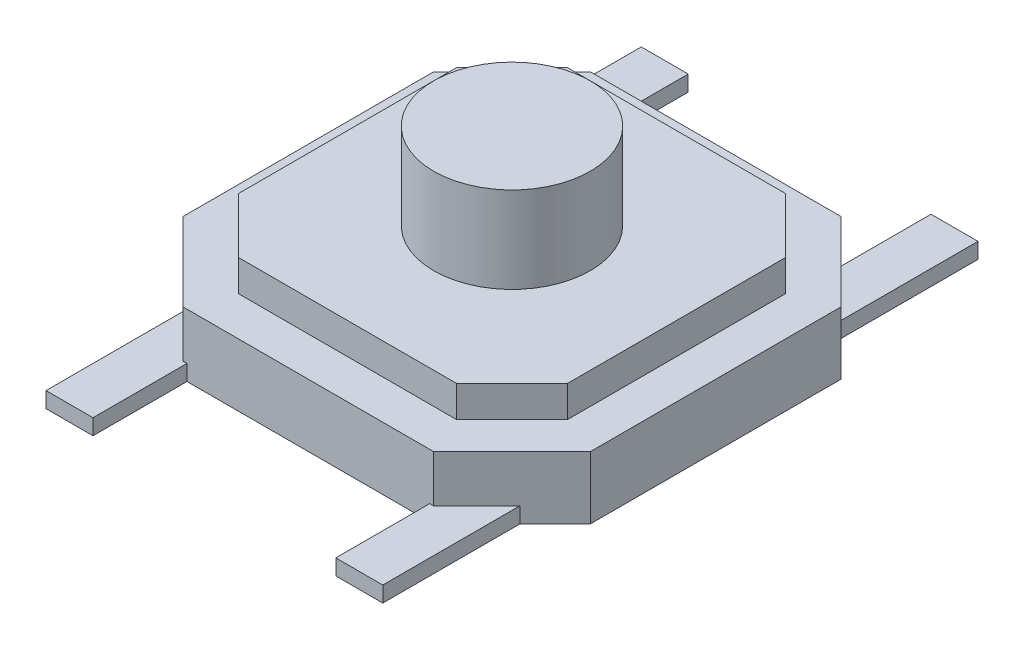
ISO-10303-21;
HEADER;
FILE_DESCRIPTION(('STEP AP214'),'2;1');
FILE_NAME('part.step','',(''),(''),'','','');
FILE_SCHEMA(('AUTOMOTIVE_DESIGN { 1 0 10303 214 1 1 1 1 }'));
ENDSEC;
DATA;
#1=APPLICATION_CONTEXT('core data for automotive mechanical design processes');
#2=APPLICATION_PROTOCOL_DEFINITION('international standard','automotive_design',2000,#1);
#3=PRODUCT_CONTEXT('',#1,'mechanical');
#4=PRODUCT('Part','Part','',(#3));
#5=PRODUCT_RELATED_PRODUCT_CATEGORY('part','',(#4));
#6=PRODUCT_DEFINITION_FORMATION('','',#4);
#7=PRODUCT_DEFINITION_CONTEXT('part definition',#1,'design');
#8=PRODUCT_DEFINITION('design','',#6,#7);
#9=PRODUCT_DEFINITION_SHAPE('','',#8);
#10=(LENGTH_UNIT() NAMED_UNIT(*) SI_UNIT(.MILLI.,.METRE.));
#11=(NAMED_UNIT(*) PLANE_ANGLE_UNIT() SI_UNIT($,.RADIAN.));
#12=(NAMED_UNIT(*) SI_UNIT($,.STERADIAN.) SOLID_ANGLE_UNIT());
#13=UNCERTAINTY_MEASURE_WITH_UNIT(LENGTH_MEASURE(1.E-05),#10,'distance_accuracy_value','');
#14=(GEOMETRIC_REPRESENTATION_CONTEXT(3) GLOBAL_UNCERTAINTY_ASSIGNED_CONTEXT((#13)) GLOBAL_UNIT_ASSIGNED_CONTEXT((#10,
#11,#12)) REPRESENTATION_CONTEXT('',''));
#15=CARTESIAN_POINT('',(0.,0.,0.));
#16=DIRECTION('',(0.,0.,1.));
#17=DIRECTION('',(1.,0.,0.));
#18=AXIS2_PLACEMENT_3D('',#15,#16,#17);
#19=CARTESIAN_POINT('',(-2.6,1.2,-2.60000000000001));
#20=DIRECTION('',(0.,1.,0.));
#21=DIRECTION('',(0.,0.,1.));
#22=AXIS2_PLACEMENT_3D('',#19,#20,#21);
#23=PLANE('',#22);
#24=DIRECTION('',(-1.,0.,0.));
#25=VECTOR('',#24,1.);
#26=CARTESIAN_POINT('',(1.39289321881345,1.2,-2.10000000000001));
#27=LINE('',#26,#25);
#28=CARTESIAN_POINT('',(1.39289321881345,1.2,-2.10000000000001));
#29=VERTEX_POINT('',#28);
#30=CARTESIAN_POINT('',(-1.39289321881345,1.2,-2.10000000000001));
#31=VERTEX_POINT('',#30);
#32=EDGE_CURVE('E363',#29,#31,#27,.T.);
#33=ORIENTED_EDGE('',*,*,#32,.T.);
#34=DIRECTION('',(-0.707106781186549,0.,0.707106781186546));
#35=VECTOR('',#34,1.);
#36=CARTESIAN_POINT('',(-1.39289321881345,1.2,-2.10000000000001));
#37=LINE('',#36,#35);
#38=CARTESIAN_POINT('',(-2.1,1.2,-1.39289321881346));
#39=VERTEX_POINT('',#38);
#40=EDGE_CURVE('E410',#31,#39,#37,.T.);
#41=ORIENTED_EDGE('',*,*,#40,.T.);
#42=DIRECTION('',(0.,0.,1.));
#43=VECTOR('',#42,1.);
#44=CARTESIAN_POINT('',(-2.1,1.2,-1.39289321881346));
#45=LINE('',#44,#43);
#46=CARTESIAN_POINT('',(-2.1,1.2,1.39289321881344));
#47=VERTEX_POINT('',#46);
#48=EDGE_CURVE('E407',#39,#47,#45,.T.);
#49=ORIENTED_EDGE('',*,*,#48,.T.);
#50=DIRECTION('',(0.707106781186546,0.,0.707106781186549));
#51=VECTOR('',#50,1.);
#52=CARTESIAN_POINT('',(-2.1,1.2,1.39289321881344));
#53=LINE('',#52,#51);
#54=CARTESIAN_POINT('',(-1.39289321881345,1.2,2.09999999999999));
#55=VERTEX_POINT('',#54);
#56=EDGE_CURVE('E404',#47,#55,#53,.T.);
#57=ORIENTED_EDGE('',*,*,#56,.T.);
#58=DIRECTION('',(1.,0.,0.));
#59=VECTOR('',#58,1.);
#60=CARTESIAN_POINT('',(-1.39289321881345,1.2,2.09999999999999));
#61=LINE('',#60,#59);
#62=CARTESIAN_POINT('',(1.39289321881347,1.2,2.09999999999999));
#63=VERTEX_POINT('',#62);
#64=EDGE_CURVE('E401',#55,#63,#61,.T.);
#65=ORIENTED_EDGE('',*,*,#64,.T.);
#66=DIRECTION('',(0.707106781186549,0.,-0.707106781186546));
#67=VECTOR('',#66,1.);
#68=CARTESIAN_POINT('',(1.39289321881347,1.2,2.09999999999999));
#69=LINE('',#68,#67);
#70=CARTESIAN_POINT('',(2.10000000000002,1.2,1.39289321881345));
#71=VERTEX_POINT('',#70);
#72=EDGE_CURVE('E398',#63,#71,#69,.T.);
#73=ORIENTED_EDGE('',*,*,#72,.T.);
#74=DIRECTION('',(0.,0.,-1.));
#75=VECTOR('',#74,1.);
#76=CARTESIAN_POINT('',(2.10000000000002,1.2,1.39289321881345));
#77=LINE('',#76,#75);
#78=CARTESIAN_POINT('',(2.1,1.2,-1.39289321881346));
#79=VERTEX_POINT('',#78);
#80=EDGE_CURVE('E395',#71,#79,#77,.T.);
#81=ORIENTED_EDGE('',*,*,#80,.T.);
#82=DIRECTION('',(-0.70710678118655,0.,-0.707106781186545));
#83=VECTOR('',#82,1.);
#84=CARTESIAN_POINT('',(2.1,1.2,-1.39289321881346));
#85=LINE('',#84,#83);
#86=EDGE_CURVE('E391',#79,#29,#85,.T.);
#87=ORIENTED_EDGE('',*,*,#86,.T.);
#88=EDGE_LOOP('',(#33,#41,#49,#57,#65,#73,#81,#87));
#89=FACE_BOUND('',#88,.T.);
#90=CARTESIAN_POINT('',(0.,1.2,0.));
#91=DIRECTION('',(0.,1.,0.));
#92=DIRECTION('',(0.,0.,1.));
#93=AXIS2_PLACEMENT_3D('',#90,#91,#92);
#94=CIRCLE('',#93,1.);
#95=CARTESIAN_POINT('',(0.,1.2,1.));
#96=VERTEX_POINT('',#95);
#97=EDGE_CURVE('E353',#96,#96,#94,.T.);
#98=ORIENTED_EDGE('',*,*,#97,.F.);
#99=EDGE_LOOP('',(#98));
#100=FACE_BOUND('',#99,.T.);
#101=ADVANCED_FACE('F35',(#89,#100),#23,.T.);
#102=CARTESIAN_POINT('',(-2.6,0.8,-2.60000000000001));
#103=DIRECTION('',(0.,1.,0.));
#104=DIRECTION('',(0.,0.,1.));
#105=AXIS2_PLACEMENT_3D('',#102,#103,#104);
#106=PLANE('',#105);
#107=DIRECTION('',(0.,0.,-1.));
#108=VECTOR('',#107,1.);
#109=CARTESIAN_POINT('',(2.6,0.8,-2.60000000000001));
#110=LINE('',#109,#108);
#111=CARTESIAN_POINT('',(2.60000000000002,0.8,1.6));
#112=VERTEX_POINT('',#111);
#113=CARTESIAN_POINT('',(2.6,0.8,-1.6));
#114=VERTEX_POINT('',#113);
#115=EDGE_CURVE('E431',#112,#114,#110,.T.);
#116=ORIENTED_EDGE('',*,*,#115,.T.);
#117=DIRECTION('',(0.70710678118655,0.,0.707106781186545));
#118=VECTOR('',#117,1.);
#119=CARTESIAN_POINT('',(-0.500000000000016,0.8,-4.7));
#120=LINE('',#119,#118);
#121=CARTESIAN_POINT('',(1.59999999999999,0.8,-2.60000000000001));
#122=VERTEX_POINT('',#121);
#123=EDGE_CURVE('E473',#114,#122,#120,.F.);
#124=ORIENTED_EDGE('',*,*,#123,.T.);
#125=DIRECTION('',(-1.,0.,0.));
#126=VECTOR('',#125,1.);
#127=CARTESIAN_POINT('',(-2.6,0.8,-2.60000000000001));
#128=LINE('',#127,#126);
#129=CARTESIAN_POINT('',(-1.6,0.8,-2.60000000000001));
#130=VERTEX_POINT('',#129);
#131=EDGE_CURVE('E434',#122,#130,#128,.T.);
#132=ORIENTED_EDGE('',*,*,#131,.T.);
#133=DIRECTION('',(0.707106781186549,0.,-0.707106781186546));
#134=VECTOR('',#133,1.);
#135=CARTESIAN_POINT('',(-2.1,0.8,-2.10000000000001));
#136=LINE('',#135,#134);
#137=CARTESIAN_POINT('',(-2.6,0.8,-1.60000000000001));
#138=VERTEX_POINT('',#137);
#139=EDGE_CURVE('E467',#130,#138,#136,.F.);
#140=ORIENTED_EDGE('',*,*,#139,.T.);
#141=DIRECTION('',(0.,0.,1.));
#142=VECTOR('',#141,1.);
#143=CARTESIAN_POINT('',(-2.6,0.8,-2.60000000000001));
#144=LINE('',#143,#142);
#145=CARTESIAN_POINT('',(-2.6,0.8,1.59999999999999));
#146=VERTEX_POINT('',#145);
#147=EDGE_CURVE('E424',#138,#146,#144,.T.);
#148=ORIENTED_EDGE('',*,*,#147,.T.);
#149=DIRECTION('',(-0.707106781186547,0.,-0.707106781186548));
#150=VECTOR('',#149,1.);
#151=CARTESIAN_POINT('',(-4.7,0.8,-0.500000000000014));
#152=LINE('',#151,#150);
#153=CARTESIAN_POINT('',(-1.6,0.8,2.59999999999999));
#154=VERTEX_POINT('',#153);
#155=EDGE_CURVE('E469',#146,#154,#152,.F.);
#156=ORIENTED_EDGE('',*,*,#155,.T.);
#157=DIRECTION('',(1.,0.,0.));
#158=VECTOR('',#157,1.);
#159=CARTESIAN_POINT('',(-2.6,0.8,2.59999999999999));
#160=LINE('',#159,#158);
#161=CARTESIAN_POINT('',(1.60000000000002,0.8,2.59999999999999));
#162=VERTEX_POINT('',#161);
#163=EDGE_CURVE('E427',#154,#162,#160,.T.);
#164=ORIENTED_EDGE('',*,*,#163,.T.);
#165=DIRECTION('',(-0.707106781186549,0.,0.707106781186546));
#166=VECTOR('',#165,1.);
#167=CARTESIAN_POINT('',(2.1,0.8,2.10000000000001));
#168=LINE('',#167,#166);
#169=EDGE_CURVE('E471',#162,#112,#168,.F.);
#170=ORIENTED_EDGE('',*,*,#169,.T.);
#171=EDGE_LOOP('',(#116,#124,#132,#140,#148,#156,#164,#170));
#172=FACE_BOUND('',#171,.T.);
#173=DIRECTION('',(0.,0.,1.));
#174=VECTOR('',#173,1.);
#175=CARTESIAN_POINT('',(-2.1,0.8,-1.39289321881346));
#176=LINE('',#175,#174);
#177=CARTESIAN_POINT('',(-2.1,0.8,-1.39289321881346));
#178=VERTEX_POINT('',#177);
#179=CARTESIAN_POINT('',(-2.1,0.8,1.39289321881344));
#180=VERTEX_POINT('',#179);
#181=EDGE_CURVE('E384',#178,#180,#176,.T.);
#182=ORIENTED_EDGE('',*,*,#181,.F.);
#183=DIRECTION('',(-0.707106781186549,0.,0.707106781186546));
#184=VECTOR('',#183,1.);
#185=CARTESIAN_POINT('',(-1.39289321881345,0.8,-2.10000000000001));
#186=LINE('',#185,#184);
#187=CARTESIAN_POINT('',(-1.39289321881345,0.8,-2.10000000000001));
#188=VERTEX_POINT('',#187);
#189=EDGE_CURVE('E388',#188,#178,#186,.T.);
#190=ORIENTED_EDGE('',*,*,#189,.F.);
#191=DIRECTION('',(-1.,0.,0.));
#192=VECTOR('',#191,1.);
#193=CARTESIAN_POINT('',(1.39289321881345,0.8,-2.10000000000001));
#194=LINE('',#193,#192);
#195=CARTESIAN_POINT('',(1.39289321881345,0.8,-2.10000000000001));
#196=VERTEX_POINT('',#195);
#197=EDGE_CURVE('E360',#196,#188,#194,.T.);
#198=ORIENTED_EDGE('',*,*,#197,.F.);
#199=DIRECTION('',(-0.70710678118655,0.,-0.707106781186545));
#200=VECTOR('',#199,1.);
#201=CARTESIAN_POINT('',(2.1,0.8,-1.39289321881346));
#202=LINE('',#201,#200);
#203=CARTESIAN_POINT('',(2.1,0.8,-1.39289321881346));
#204=VERTEX_POINT('',#203);
#205=EDGE_CURVE('E365',#204,#196,#202,.T.);
#206=ORIENTED_EDGE('',*,*,#205,.F.);
#207=DIRECTION('',(0.,0.,-1.));
#208=VECTOR('',#207,1.);
#209=CARTESIAN_POINT('',(2.10000000000002,0.8,1.39289321881345));
#210=LINE('',#209,#208);
#211=CARTESIAN_POINT('',(2.10000000000002,0.8,1.39289321881345));
#212=VERTEX_POINT('',#211);
#213=EDGE_CURVE('E368',#212,#204,#210,.T.);
#214=ORIENTED_EDGE('',*,*,#213,.F.);
#215=DIRECTION('',(0.707106781186549,0.,-0.707106781186546));
#216=VECTOR('',#215,1.);
#217=CARTESIAN_POINT('',(1.39289321881347,0.8,2.09999999999999));
#218=LINE('',#217,#216);
#219=CARTESIAN_POINT('',(1.39289321881347,0.8,2.09999999999999));
#220=VERTEX_POINT('',#219);
#221=EDGE_CURVE('E372',#220,#212,#218,.T.);
#222=ORIENTED_EDGE('',*,*,#221,.F.);
#223=DIRECTION('',(1.,0.,0.));
#224=VECTOR('',#223,1.);
#225=CARTESIAN_POINT('',(-1.39289321881345,0.8,2.09999999999999));
#226=LINE('',#225,#224);
#227=CARTESIAN_POINT('',(-1.39289321881345,0.8,2.09999999999999));
#228=VERTEX_POINT('',#227);
#229=EDGE_CURVE('E376',#228,#220,#226,.T.);
#230=ORIENTED_EDGE('',*,*,#229,.F.);
#231=DIRECTION('',(0.707106781186546,0.,0.707106781186549));
#232=VECTOR('',#231,1.);
#233=CARTESIAN_POINT('',(-2.1,0.8,1.39289321881344));
#234=LINE('',#233,#232);
#235=EDGE_CURVE('E380',#180,#228,#234,.T.);
#236=ORIENTED_EDGE('',*,*,#235,.F.);
#237=EDGE_LOOP('',(#182,#190,#198,#206,#214,#222,#230,#236));
#238=FACE_BOUND('',#237,.T.);
#239=ADVANCED_FACE('F519',(#172,#238),#106,.T.);
#240=CARTESIAN_POINT('',(-2.6,0.8,-2.60000000000001));
#241=DIRECTION('',(1.,0.,0.));
#242=DIRECTION('',(0.,0.,-1.));
#243=AXIS2_PLACEMENT_3D('',#240,#241,#242);
#244=PLANE('',#243);
#245=DIRECTION('',(0.,0.,1.));
#246=VECTOR('',#245,1.);
#247=CARTESIAN_POINT('',(-2.6,0.,-2.60000000000001));
#248=LINE('',#247,#246);
#249=CARTESIAN_POINT('',(-2.6,0.,-1.60000000000001));
#250=VERTEX_POINT('',#249);
#251=CARTESIAN_POINT('',(-2.6,0.,1.59999999999999));
#252=VERTEX_POINT('',#251);
#253=EDGE_CURVE('E394',#250,#252,#248,.T.);
#254=ORIENTED_EDGE('',*,*,#253,.T.);
#255=DIRECTION('',(0.,1.,0.));
#256=VECTOR('',#255,1.);
#257=CARTESIAN_POINT('',(-2.6,0.8,1.59999999999999));
#258=LINE('',#257,#256);
#259=EDGE_CURVE('E483',#252,#146,#258,.T.);
#260=ORIENTED_EDGE('',*,*,#259,.T.);
#261=ORIENTED_EDGE('',*,*,#147,.F.);
#262=DIRECTION('',(0.,-1.,0.));
#263=VECTOR('',#262,1.);
#264=CARTESIAN_POINT('',(-2.6,0.8,-1.60000000000001));
#265=LINE('',#264,#263);
#266=EDGE_CURVE('E480',#138,#250,#265,.T.);
#267=ORIENTED_EDGE('',*,*,#266,.T.);
#268=EDGE_LOOP('',(#254,#260,#261,#267));
#269=FACE_BOUND('',#268,.T.);
#270=ADVANCED_FACE('F515',(#269),#244,.F.);
#271=CARTESIAN_POINT('',(-2.6,0.8,2.59999999999999));
#272=DIRECTION('',(0.,0.,-1.));
#273=DIRECTION('',(-1.,0.,0.));
#274=AXIS2_PLACEMENT_3D('',#271,#272,#273);
#275=PLANE('',#274);
#276=DIRECTION('',(1.,0.,0.));
#277=VECTOR('',#276,1.);
#278=CARTESIAN_POINT('',(-2.6,0.,2.59999999999999));
#279=LINE('',#278,#277);
#280=CARTESIAN_POINT('',(-1.55,0.,2.59999999999999));
#281=VERTEX_POINT('',#280);
#282=CARTESIAN_POINT('',(1.55,0.,2.59999999999999));
#283=VERTEX_POINT('',#282);
#284=EDGE_CURVE('E440',#281,#283,#279,.T.);
#285=ORIENTED_EDGE('',*,*,#284,.T.);
#286=DIRECTION('',(0.,1.,0.));
#287=VECTOR('',#286,1.);
#288=CARTESIAN_POINT('',(1.55,0.8,2.59999999999999));
#289=LINE('',#288,#287);
#290=CARTESIAN_POINT('',(1.55,0.2,2.59999999999999));
#291=VERTEX_POINT('',#290);
#292=EDGE_CURVE('E327',#283,#291,#289,.T.);
#293=ORIENTED_EDGE('',*,*,#292,.T.);
#294=DIRECTION('',(-1.,0.,0.));
#295=VECTOR('',#294,1.);
#296=CARTESIAN_POINT('',(-2.6,0.2,2.59999999999999));
#297=LINE('',#296,#295);
#298=CARTESIAN_POINT('',(1.60000000000002,0.2,2.59999999999999));
#299=VERTEX_POINT('',#298);
#300=EDGE_CURVE('E323',#299,#291,#297,.T.);
#301=ORIENTED_EDGE('',*,*,#300,.F.);
#302=DIRECTION('',(0.,1.,0.));
#303=VECTOR('',#302,1.);
#304=CARTESIAN_POINT('',(1.60000000000002,0.8,2.59999999999999));
#305=LINE('',#304,#303);
#306=EDGE_CURVE('E478',#299,#162,#305,.T.);
#307=ORIENTED_EDGE('',*,*,#306,.T.);
#308=ORIENTED_EDGE('',*,*,#163,.F.);
#309=DIRECTION('',(0.,-1.,0.));
#310=VECTOR('',#309,1.);
#311=CARTESIAN_POINT('',(-1.6,0.8,2.59999999999999));
#312=LINE('',#311,#310);
#313=CARTESIAN_POINT('',(-1.6,0.2,2.59999999999999));
#314=VERTEX_POINT('',#313);
#315=EDGE_CURVE('E475',#154,#314,#312,.T.);
#316=ORIENTED_EDGE('',*,*,#315,.T.);
#317=DIRECTION('',(-1.,0.,0.));
#318=VECTOR('',#317,1.);
#319=CARTESIAN_POINT('',(-2.6,0.2,2.59999999999999));
#320=LINE('',#319,#318);
#321=CARTESIAN_POINT('',(-1.55,0.2,2.59999999999999));
#322=VERTEX_POINT('',#321);
#323=EDGE_CURVE('E346',#322,#314,#320,.T.);
#324=ORIENTED_EDGE('',*,*,#323,.F.);
#325=DIRECTION('',(0.,-1.,0.));
#326=VECTOR('',#325,1.);
#327=CARTESIAN_POINT('',(-1.55,0.8,2.59999999999999));
#328=LINE('',#327,#326);
#329=EDGE_CURVE('E350',#322,#281,#328,.T.);
#330=ORIENTED_EDGE('',*,*,#329,.T.);
#331=EDGE_LOOP('',(#285,#293,#301,#307,#308,#316,#324,#330));
#332=FACE_BOUND('',#331,.T.);
#333=ADVANCED_FACE('F529',(#332),#275,.F.);
#334=CARTESIAN_POINT('',(2.6,0.8,-2.60000000000001));
#335=DIRECTION('',(-1.,0.,0.));
#336=DIRECTION('',(0.,0.,1.));
#337=AXIS2_PLACEMENT_3D('',#334,#335,#336);
#338=PLANE('',#337);
#339=DIRECTION('',(0.,0.,-1.));
#340=VECTOR('',#339,1.);
#341=CARTESIAN_POINT('',(2.6,0.,-2.60000000000001));
#342=LINE('',#341,#340);
#343=CARTESIAN_POINT('',(2.60000000000002,0.,1.6));
#344=VERTEX_POINT('',#343);
#345=CARTESIAN_POINT('',(2.6,0.,-1.6));
#346=VERTEX_POINT('',#345);
#347=EDGE_CURVE('E443',#344,#346,#342,.T.);
#348=ORIENTED_EDGE('',*,*,#347,.T.);
#349=DIRECTION('',(0.,1.,0.));
#350=VECTOR('',#349,1.);
#351=CARTESIAN_POINT('',(2.6,0.8,-1.6));
#352=LINE('',#351,#350);
#353=EDGE_CURVE('E465',#346,#114,#352,.T.);
#354=ORIENTED_EDGE('',*,*,#353,.T.);
#355=ORIENTED_EDGE('',*,*,#115,.F.);
#356=DIRECTION('',(0.,-1.,0.));
#357=VECTOR('',#356,1.);
#358=CARTESIAN_POINT('',(2.60000000000002,0.8,1.6));
#359=LINE('',#358,#357);
#360=EDGE_CURVE('E462',#112,#344,#359,.T.);
#361=ORIENTED_EDGE('',*,*,#360,.T.);
#362=EDGE_LOOP('',(#348,#354,#355,#361));
#363=FACE_BOUND('',#362,.T.);
#364=ADVANCED_FACE('F540',(#363),#338,.F.);
#365=CARTESIAN_POINT('',(-2.6,0.8,-2.60000000000001));
#366=DIRECTION('',(0.,0.,1.));
#367=DIRECTION('',(1.,0.,0.));
#368=AXIS2_PLACEMENT_3D('',#365,#366,#367);
#369=PLANE('',#368);
#370=DIRECTION('',(-1.,0.,0.));
#371=VECTOR('',#370,1.);
#372=CARTESIAN_POINT('',(-2.6,0.,-2.60000000000001));
#373=LINE('',#372,#371);
#374=CARTESIAN_POINT('',(1.55,0.,-2.60000000000001));
#375=VERTEX_POINT('',#374);
#376=CARTESIAN_POINT('',(-1.55,0.,-2.60000000000001));
#377=VERTEX_POINT('',#376);
#378=EDGE_CURVE('E428',#375,#377,#373,.T.);
#379=ORIENTED_EDGE('',*,*,#378,.T.);
#380=DIRECTION('',(0.,1.,0.));
#381=VECTOR('',#380,1.);
#382=CARTESIAN_POINT('',(-1.55,0.8,-2.60000000000001));
#383=LINE('',#382,#381);
#384=CARTESIAN_POINT('',(-1.55,0.2,-2.60000000000001));
#385=VERTEX_POINT('',#384);
#386=EDGE_CURVE('E278',#377,#385,#383,.T.);
#387=ORIENTED_EDGE('',*,*,#386,.T.);
#388=DIRECTION('',(1.,0.,0.));
#389=VECTOR('',#388,1.);
#390=CARTESIAN_POINT('',(-2.6,0.2,-2.60000000000001));
#391=LINE('',#390,#389);
#392=CARTESIAN_POINT('',(-1.6,0.2,-2.60000000000001));
#393=VERTEX_POINT('',#392);
#394=EDGE_CURVE('E275',#393,#385,#391,.T.);
#395=ORIENTED_EDGE('',*,*,#394,.F.);
#396=DIRECTION('',(0.,1.,0.));
#397=VECTOR('',#396,1.);
#398=CARTESIAN_POINT('',(-1.6,0.8,-2.60000000000001));
#399=LINE('',#398,#397);
#400=EDGE_CURVE('E437',#393,#130,#399,.T.);
#401=ORIENTED_EDGE('',*,*,#400,.T.);
#402=ORIENTED_EDGE('',*,*,#131,.F.);
#403=DIRECTION('',(0.,-1.,0.));
#404=VECTOR('',#403,1.);
#405=CARTESIAN_POINT('',(1.59999999999999,0.8,-2.60000000000001));
#406=LINE('',#405,#404);
#407=CARTESIAN_POINT('',(1.59999999999999,0.2,-2.60000000000001));
#408=VERTEX_POINT('',#407);
#409=EDGE_CURVE('E449',#122,#408,#406,.T.);
#410=ORIENTED_EDGE('',*,*,#409,.T.);
#411=DIRECTION('',(1.,0.,0.));
#412=VECTOR('',#411,1.);
#413=CARTESIAN_POINT('',(-2.6,0.2,-2.60000000000001));
#414=LINE('',#413,#412);
#415=CARTESIAN_POINT('',(1.55,0.2,-2.60000000000001));
#416=VERTEX_POINT('',#415);
#417=EDGE_CURVE('E297',#416,#408,#414,.T.);
#418=ORIENTED_EDGE('',*,*,#417,.F.);
#419=DIRECTION('',(0.,-1.,0.));
#420=VECTOR('',#419,1.);
#421=CARTESIAN_POINT('',(1.55,0.8,-2.60000000000001));
#422=LINE('',#421,#420);
#423=EDGE_CURVE('E301',#416,#375,#422,.T.);
#424=ORIENTED_EDGE('',*,*,#423,.T.);
#425=EDGE_LOOP('',(#379,#387,#395,#401,#402,#410,#418,#424));
#426=FACE_BOUND('',#425,.T.);
#427=ADVANCED_FACE('F504',(#426),#369,.F.);
#428=CARTESIAN_POINT('',(-2.6,0.,-2.60000000000001));
#429=DIRECTION('',(0.,1.,0.));
#430=DIRECTION('',(0.,0.,1.));
#431=AXIS2_PLACEMENT_3D('',#428,#429,#430);
#432=PLANE('',#431);
#433=DIRECTION('',(0.,0.,1.));
#434=VECTOR('',#433,1.);
#435=CARTESIAN_POINT('',(-1.55,0.,-1.13168776971169));
#436=LINE('',#435,#434);
#437=CARTESIAN_POINT('',(-1.55,0.,-3.79999999999999));
#438=VERTEX_POINT('',#437);
#439=EDGE_CURVE('E254',#438,#377,#436,.T.);
#440=ORIENTED_EDGE('',*,*,#439,.T.);
#441=ORIENTED_EDGE('',*,*,#378,.F.);
#442=DIRECTION('',(0.,0.,-1.));
#443=VECTOR('',#442,1.);
#444=CARTESIAN_POINT('',(1.55,0.,-1.13168776971169));
#445=LINE('',#444,#443);
#446=CARTESIAN_POINT('',(1.55,0.,-3.79999999999999));
#447=VERTEX_POINT('',#446);
#448=EDGE_CURVE('E281',#375,#447,#445,.T.);
#449=ORIENTED_EDGE('',*,*,#448,.T.);
#450=DIRECTION('',(1.,0.,0.));
#451=VECTOR('',#450,1.);
#452=CARTESIAN_POINT('',(1.55,0.,-3.79999999999999));
#453=LINE('',#452,#451);
#454=CARTESIAN_POINT('',(2.15,0.,-3.79999999999999));
#455=VERTEX_POINT('',#454);
#456=EDGE_CURVE('E292',#447,#455,#453,.T.);
#457=ORIENTED_EDGE('',*,*,#456,.T.);
#458=DIRECTION('',(0.,0.,1.));
#459=VECTOR('',#458,1.);
#460=CARTESIAN_POINT('',(2.15,0.,-1.13168776971169));
#461=LINE('',#460,#459);
#462=CARTESIAN_POINT('',(2.15,0.,-2.05000000000001));
#463=VERTEX_POINT('',#462);
#464=EDGE_CURVE('E50',#455,#463,#461,.T.);
#465=ORIENTED_EDGE('',*,*,#464,.T.);
#466=DIRECTION('',(-0.70710678118655,0.,-0.707106781186545));
#467=VECTOR('',#466,1.);
#468=CARTESIAN_POINT('',(1.59999999999999,0.,-2.60000000000001));
#469=LINE('',#468,#467);
#470=EDGE_CURVE('E460',#463,#346,#469,.F.);
#471=ORIENTED_EDGE('',*,*,#470,.T.);
#472=ORIENTED_EDGE('',*,*,#347,.F.);
#473=DIRECTION('',(0.707106781186549,0.,-0.707106781186546));
#474=VECTOR('',#473,1.);
#475=CARTESIAN_POINT('',(2.60000000000002,0.,1.6));
#476=LINE('',#475,#474);
#477=CARTESIAN_POINT('',(2.15,0.,2.05000000000001));
#478=VERTEX_POINT('',#477);
#479=EDGE_CURVE('E457',#344,#478,#476,.F.);
#480=ORIENTED_EDGE('',*,*,#479,.T.);
#481=DIRECTION('',(0.,0.,1.));
#482=VECTOR('',#481,1.);
#483=CARTESIAN_POINT('',(2.15,0.,1.13168776971169));
#484=LINE('',#483,#482);
#485=CARTESIAN_POINT('',(2.15,0.,3.79999999999999));
#486=VERTEX_POINT('',#485);
#487=EDGE_CURVE('E304',#478,#486,#484,.T.);
#488=ORIENTED_EDGE('',*,*,#487,.T.);
#489=DIRECTION('',(-1.,0.,0.));
#490=VECTOR('',#489,1.);
#491=CARTESIAN_POINT('',(1.55,0.,3.79999999999999));
#492=LINE('',#491,#490);
#493=CARTESIAN_POINT('',(1.55,0.,3.79999999999999));
#494=VERTEX_POINT('',#493);
#495=EDGE_CURVE('E316',#486,#494,#492,.T.);
#496=ORIENTED_EDGE('',*,*,#495,.T.);
#497=DIRECTION('',(0.,0.,-1.));
#498=VECTOR('',#497,1.);
#499=CARTESIAN_POINT('',(1.55,0.,1.13168776971169));
#500=LINE('',#499,#498);
#501=EDGE_CURVE('E308',#494,#283,#500,.T.);
#502=ORIENTED_EDGE('',*,*,#501,.T.);
#503=ORIENTED_EDGE('',*,*,#284,.F.);
#504=DIRECTION('',(0.,0.,1.));
#505=VECTOR('',#504,1.);
#506=CARTESIAN_POINT('',(-1.55,0.,1.13168776971169));
#507=LINE('',#506,#505);
#508=CARTESIAN_POINT('',(-1.55,0.,3.79999999999999));
#509=VERTEX_POINT('',#508);
#510=EDGE_CURVE('E330',#281,#509,#507,.T.);
#511=ORIENTED_EDGE('',*,*,#510,.T.);
#512=DIRECTION('',(-1.,0.,0.));
#513=VECTOR('',#512,1.);
#514=CARTESIAN_POINT('',(-1.55,0.,3.79999999999999));
#515=LINE('',#514,#513);
#516=CARTESIAN_POINT('',(-2.15,0.,3.79999999999999));
#517=VERTEX_POINT('',#516);
#518=EDGE_CURVE('E341',#509,#517,#515,.T.);
#519=ORIENTED_EDGE('',*,*,#518,.T.);
#520=DIRECTION('',(0.,0.,-1.));
#521=VECTOR('',#520,1.);
#522=CARTESIAN_POINT('',(-2.15,0.,1.13168776971169));
#523=LINE('',#522,#521);
#524=CARTESIAN_POINT('',(-2.15,0.,2.04999999999999));
#525=VERTEX_POINT('',#524);
#526=EDGE_CURVE('E57',#517,#525,#523,.T.);
#527=ORIENTED_EDGE('',*,*,#526,.T.);
#528=DIRECTION('',(0.707106781186547,0.,0.707106781186548));
#529=VECTOR('',#528,1.);
#530=CARTESIAN_POINT('',(-1.6,0.,2.59999999999999));
#531=LINE('',#530,#529);
#532=EDGE_CURVE('E455',#525,#252,#531,.F.);
#533=ORIENTED_EDGE('',*,*,#532,.T.);
#534=ORIENTED_EDGE('',*,*,#253,.F.);
#535=DIRECTION('',(-0.707106781186549,0.,0.707106781186546));
#536=VECTOR('',#535,1.);
#537=CARTESIAN_POINT('',(-2.6,0.,-1.60000000000001));
#538=LINE('',#537,#536);
#539=CARTESIAN_POINT('',(-2.15,0.,-2.05000000000001));
#540=VERTEX_POINT('',#539);
#541=EDGE_CURVE('E452',#250,#540,#538,.F.);
#542=ORIENTED_EDGE('',*,*,#541,.T.);
#543=DIRECTION('',(0.,0.,-1.));
#544=VECTOR('',#543,1.);
#545=CARTESIAN_POINT('',(-2.15,0.,-1.13168776971169));
#546=LINE('',#545,#544);
#547=CARTESIAN_POINT('',(-2.15,0.,-3.79999999999999));
#548=VERTEX_POINT('',#547);
#549=EDGE_CURVE('E270',#540,#548,#546,.T.);
#550=ORIENTED_EDGE('',*,*,#549,.T.);
#551=DIRECTION('',(1.,0.,0.));
#552=VECTOR('',#551,1.);
#553=CARTESIAN_POINT('',(-1.55,0.,-3.79999999999999));
#554=LINE('',#553,#552);
#555=EDGE_CURVE('E261',#548,#438,#554,.T.);
#556=ORIENTED_EDGE('',*,*,#555,.T.);
#557=EDGE_LOOP('',(#440,#441,#449,#457,#465,#471,#472,#480,#488,#496,#502,#503,#511,#519,#527,
#533,#534,#542,#550,#556));
#558=FACE_BOUND('',#557,.T.);
#559=ADVANCED_FACE('F510',(#558),#432,.F.);
#560=CARTESIAN_POINT('',(1.59999999999999,0.8,-2.60000000000001));
#561=DIRECTION('',(-0.707106781186545,0.,0.70710678118655));
#562=DIRECTION('',(0.,-1.,0.));
#563=AXIS2_PLACEMENT_3D('',#560,#561,#562);
#564=PLANE('',#563);
#565=DIRECTION('',(0.,1.,0.));
#566=VECTOR('',#565,1.);
#567=CARTESIAN_POINT('',(2.15,0.8,-2.05000000000001));
#568=LINE('',#567,#566);
#569=CARTESIAN_POINT('',(2.15,0.2,-2.05000000000001));
#570=VERTEX_POINT('',#569);
#571=EDGE_CURVE('E498',#570,#463,#568,.F.);
#572=ORIENTED_EDGE('',*,*,#571,.F.);
#573=DIRECTION('',(0.70710678118655,0.,0.707106781186545));
#574=VECTOR('',#573,1.);
#575=CARTESIAN_POINT('',(1.59999999999999,0.2,-2.60000000000001));
#576=LINE('',#575,#574);
#577=EDGE_CURVE('E495',#570,#408,#576,.F.);
#578=ORIENTED_EDGE('',*,*,#577,.T.);
#579=ORIENTED_EDGE('',*,*,#409,.F.);
#580=ORIENTED_EDGE('',*,*,#123,.F.);
#581=ORIENTED_EDGE('',*,*,#353,.F.);
#582=ORIENTED_EDGE('',*,*,#470,.F.);
#583=EDGE_LOOP('',(#572,#578,#579,#580,#581,#582));
#584=FACE_BOUND('',#583,.T.);
#585=ADVANCED_FACE('F545',(#584),#564,.F.);
#586=CARTESIAN_POINT('',(2.60000000000002,0.8,1.6));
#587=DIRECTION('',(-0.707106781186546,0.,-0.707106781186549));
#588=DIRECTION('',(0.,-1.,0.));
#589=AXIS2_PLACEMENT_3D('',#586,#587,#588);
#590=PLANE('',#589);
#591=DIRECTION('',(0.,-1.,0.));
#592=VECTOR('',#591,1.);
#593=CARTESIAN_POINT('',(2.15,0.8,2.05000000000001));
#594=LINE('',#593,#592);
#595=CARTESIAN_POINT('',(2.15,0.2,2.05000000000001));
#596=VERTEX_POINT('',#595);
#597=EDGE_CURVE('E493',#478,#596,#594,.F.);
#598=ORIENTED_EDGE('',*,*,#597,.F.);
#599=ORIENTED_EDGE('',*,*,#479,.F.);
#600=ORIENTED_EDGE('',*,*,#360,.F.);
#601=ORIENTED_EDGE('',*,*,#169,.F.);
#602=ORIENTED_EDGE('',*,*,#306,.F.);
#603=DIRECTION('',(-0.707106781186549,0.,0.707106781186546));
#604=VECTOR('',#603,1.);
#605=CARTESIAN_POINT('',(2.60000000000002,0.2,1.6));
#606=LINE('',#605,#604);
#607=EDGE_CURVE('E490',#299,#596,#606,.F.);
#608=ORIENTED_EDGE('',*,*,#607,.T.);
#609=EDGE_LOOP('',(#598,#599,#600,#601,#602,#608));
#610=FACE_BOUND('',#609,.T.);
#611=ADVANCED_FACE('F537',(#610),#590,.F.);
#612=CARTESIAN_POINT('',(-1.6,0.8,2.59999999999999));
#613=DIRECTION('',(0.707106781186548,0.,-0.707106781186547));
#614=DIRECTION('',(0.,-1.,0.));
#615=AXIS2_PLACEMENT_3D('',#612,#613,#614);
#616=PLANE('',#615);
#617=DIRECTION('',(0.,1.,0.));
#618=VECTOR('',#617,1.);
#619=CARTESIAN_POINT('',(-2.15,0.8,2.04999999999999));
#620=LINE('',#619,#618);
#621=CARTESIAN_POINT('',(-2.15,0.2,2.04999999999999));
#622=VERTEX_POINT('',#621);
#623=EDGE_CURVE('E488',#622,#525,#620,.F.);
#624=ORIENTED_EDGE('',*,*,#623,.F.);
#625=DIRECTION('',(-0.707106781186547,0.,-0.707106781186548));
#626=VECTOR('',#625,1.);
#627=CARTESIAN_POINT('',(-1.6,0.2,2.59999999999999));
#628=LINE('',#627,#626);
#629=EDGE_CURVE('E485',#622,#314,#628,.F.);
#630=ORIENTED_EDGE('',*,*,#629,.T.);
#631=ORIENTED_EDGE('',*,*,#315,.F.);
#632=ORIENTED_EDGE('',*,*,#155,.F.);
#633=ORIENTED_EDGE('',*,*,#259,.F.);
#634=ORIENTED_EDGE('',*,*,#532,.F.);
#635=EDGE_LOOP('',(#624,#630,#631,#632,#633,#634));
#636=FACE_BOUND('',#635,.T.);
#637=ADVANCED_FACE('F525',(#636),#616,.F.);
#638=CARTESIAN_POINT('',(-2.6,0.8,-1.60000000000001));
#639=DIRECTION('',(0.707106781186546,0.,0.707106781186549));
#640=DIRECTION('',(0.,-1.,0.));
#641=AXIS2_PLACEMENT_3D('',#638,#639,#640);
#642=PLANE('',#641);
#643=DIRECTION('',(0.,-1.,0.));
#644=VECTOR('',#643,1.);
#645=CARTESIAN_POINT('',(-2.15,0.8,-2.05000000000001));
#646=LINE('',#645,#644);
#647=CARTESIAN_POINT('',(-2.15,0.2,-2.05000000000001));
#648=VERTEX_POINT('',#647);
#649=EDGE_CURVE('E12',#540,#648,#646,.F.);
#650=ORIENTED_EDGE('',*,*,#649,.F.);
#651=ORIENTED_EDGE('',*,*,#541,.F.);
#652=ORIENTED_EDGE('',*,*,#266,.F.);
#653=ORIENTED_EDGE('',*,*,#139,.F.);
#654=ORIENTED_EDGE('',*,*,#400,.F.);
#655=DIRECTION('',(0.707106781186549,0.,-0.707106781186546));
#656=VECTOR('',#655,1.);
#657=CARTESIAN_POINT('',(-2.6,0.2,-1.60000000000001));
#658=LINE('',#657,#656);
#659=EDGE_CURVE('E43',#393,#648,#658,.F.);
#660=ORIENTED_EDGE('',*,*,#659,.T.);
#661=EDGE_LOOP('',(#650,#651,#652,#653,#654,#660));
#662=FACE_BOUND('',#661,.T.);
#663=ADVANCED_FACE('F37',(#662),#642,.F.);
#664=CARTESIAN_POINT('',(-1.39289321881345,8.33969696196701,-2.10000000000001));
#665=DIRECTION('',(0.707106781186546,0.,0.707106781186549));
#666=DIRECTION('',(0.707106781186549,0.,-0.707106781186546));
#667=AXIS2_PLACEMENT_3D('',#664,#665,#666);
#668=PLANE('',#667);
#669=ORIENTED_EDGE('',*,*,#40,.F.);
#670=DIRECTION('',(0.,-1.,0.));
#671=VECTOR('',#670,1.);
#672=CARTESIAN_POINT('',(-1.39289321881345,8.33969696196701,-2.10000000000001));
#673=LINE('',#672,#671);
#674=EDGE_CURVE('E359',#31,#188,#673,.T.);
#675=ORIENTED_EDGE('',*,*,#674,.T.);
#676=ORIENTED_EDGE('',*,*,#189,.T.);
#677=DIRECTION('',(0.,-1.,0.));
#678=VECTOR('',#677,1.);
#679=CARTESIAN_POINT('',(-2.1,8.33969696196701,-1.39289321881346));
#680=LINE('',#679,#678);
#681=EDGE_CURVE('E387',#39,#178,#680,.T.);
#682=ORIENTED_EDGE('',*,*,#681,.F.);
#683=EDGE_LOOP('',(#669,#675,#676,#682));
#684=FACE_BOUND('',#683,.T.);
#685=ADVANCED_FACE('F584',(#684),#668,.F.);
#686=CARTESIAN_POINT('',(-2.1,8.33969696196701,-1.39289321881346));
#687=DIRECTION('',(1.,0.,0.));
#688=DIRECTION('',(0.,0.,-1.));
#689=AXIS2_PLACEMENT_3D('',#686,#687,#688);
#690=PLANE('',#689);
#691=ORIENTED_EDGE('',*,*,#48,.F.);
#692=ORIENTED_EDGE('',*,*,#681,.T.);
#693=ORIENTED_EDGE('',*,*,#181,.T.);
#694=DIRECTION('',(0.,-1.,0.));
#695=VECTOR('',#694,1.);
#696=CARTESIAN_POINT('',(-2.1,8.33969696196701,1.39289321881344));
#697=LINE('',#696,#695);
#698=EDGE_CURVE('E383',#47,#180,#697,.T.);
#699=ORIENTED_EDGE('',*,*,#698,.F.);
#700=EDGE_LOOP('',(#691,#692,#693,#699));
#701=FACE_BOUND('',#700,.T.);
#702=ADVANCED_FACE('F607',(#701),#690,.F.);
#703=CARTESIAN_POINT('',(-2.1,8.33969696196701,1.39289321881344));
#704=DIRECTION('',(0.707106781186549,0.,-0.707106781186546));
#705=DIRECTION('',(-0.707106781186546,0.,-0.707106781186549));
#706=AXIS2_PLACEMENT_3D('',#703,#704,#705);
#707=PLANE('',#706);
#708=ORIENTED_EDGE('',*,*,#56,.F.);
#709=ORIENTED_EDGE('',*,*,#698,.T.);
#710=ORIENTED_EDGE('',*,*,#235,.T.);
#711=DIRECTION('',(0.,-1.,0.));
#712=VECTOR('',#711,1.);
#713=CARTESIAN_POINT('',(-1.39289321881345,8.33969696196701,2.09999999999999));
#714=LINE('',#713,#712);
#715=EDGE_CURVE('E379',#55,#228,#714,.T.);
#716=ORIENTED_EDGE('',*,*,#715,.F.);
#717=EDGE_LOOP('',(#708,#709,#710,#716));
#718=FACE_BOUND('',#717,.T.);
#719=ADVANCED_FACE('F612',(#718),#707,.F.);
#720=CARTESIAN_POINT('',(-1.39289321881345,8.33969696196701,2.09999999999999));
#721=DIRECTION('',(0.,0.,-1.));
#722=DIRECTION('',(-1.,0.,0.));
#723=AXIS2_PLACEMENT_3D('',#720,#721,#722);
#724=PLANE('',#723);
#725=ORIENTED_EDGE('',*,*,#64,.F.);
#726=ORIENTED_EDGE('',*,*,#715,.T.);
#727=ORIENTED_EDGE('',*,*,#229,.T.);
#728=DIRECTION('',(0.,-1.,0.));
#729=VECTOR('',#728,1.);
#730=CARTESIAN_POINT('',(1.39289321881347,8.33969696196701,2.09999999999999));
#731=LINE('',#730,#729);
#732=EDGE_CURVE('E375',#63,#220,#731,.T.);
#733=ORIENTED_EDGE('',*,*,#732,.F.);
#734=EDGE_LOOP('',(#725,#726,#727,#733));
#735=FACE_BOUND('',#734,.T.);
#736=ADVANCED_FACE('F629',(#735),#724,.F.);
#737=CARTESIAN_POINT('',(1.39289321881347,8.33969696196701,2.09999999999999));
#738=DIRECTION('',(-0.707106781186546,0.,-0.707106781186549));
#739=DIRECTION('',(-0.707106781186549,0.,0.707106781186546));
#740=AXIS2_PLACEMENT_3D('',#737,#738,#739);
#741=PLANE('',#740);
#742=ORIENTED_EDGE('',*,*,#72,.F.);
#743=ORIENTED_EDGE('',*,*,#732,.T.);
#744=ORIENTED_EDGE('',*,*,#221,.T.);
#745=DIRECTION('',(0.,-1.,0.));
#746=VECTOR('',#745,1.);
#747=CARTESIAN_POINT('',(2.10000000000002,8.33969696196701,1.39289321881345));
#748=LINE('',#747,#746);
#749=EDGE_CURVE('E371',#71,#212,#748,.T.);
#750=ORIENTED_EDGE('',*,*,#749,.F.);
#751=EDGE_LOOP('',(#742,#743,#744,#750));
#752=FACE_BOUND('',#751,.T.);
#753=ADVANCED_FACE('F633',(#752),#741,.F.);
#754=CARTESIAN_POINT('',(2.10000000000002,8.33969696196701,1.39289321881345));
#755=DIRECTION('',(-1.,0.,0.));
#756=DIRECTION('',(0.,0.,1.));
#757=AXIS2_PLACEMENT_3D('',#754,#755,#756);
#758=PLANE('',#757);
#759=ORIENTED_EDGE('',*,*,#80,.F.);
#760=ORIENTED_EDGE('',*,*,#749,.T.);
#761=ORIENTED_EDGE('',*,*,#213,.T.);
#762=DIRECTION('',(0.,-1.,0.));
#763=VECTOR('',#762,1.);
#764=CARTESIAN_POINT('',(2.1,8.33969696196701,-1.39289321881346));
#765=LINE('',#764,#763);
#766=EDGE_CURVE('E367',#79,#204,#765,.T.);
#767=ORIENTED_EDGE('',*,*,#766,.F.);
#768=EDGE_LOOP('',(#759,#760,#761,#767));
#769=FACE_BOUND('',#768,.T.);
#770=ADVANCED_FACE('F638',(#769),#758,.F.);
#771=CARTESIAN_POINT('',(2.1,8.33969696196701,-1.39289321881346));
#772=DIRECTION('',(-0.707106781186545,0.,0.70710678118655));
#773=DIRECTION('',(0.70710678118655,0.,0.707106781186545));
#774=AXIS2_PLACEMENT_3D('',#771,#772,#773);
#775=PLANE('',#774);
#776=ORIENTED_EDGE('',*,*,#86,.F.);
#777=ORIENTED_EDGE('',*,*,#766,.T.);
#778=ORIENTED_EDGE('',*,*,#205,.T.);
#779=DIRECTION('',(0.,-1.,0.));
#780=VECTOR('',#779,1.);
#781=CARTESIAN_POINT('',(1.39289321881345,8.33969696196701,-2.10000000000001));
#782=LINE('',#781,#780);
#783=EDGE_CURVE('E364',#29,#196,#782,.T.);
#784=ORIENTED_EDGE('',*,*,#783,.F.);
#785=EDGE_LOOP('',(#776,#777,#778,#784));
#786=FACE_BOUND('',#785,.T.);
#787=ADVANCED_FACE('F640',(#786),#775,.F.);
#788=CARTESIAN_POINT('',(1.39289321881345,8.33969696196701,-2.10000000000001));
#789=DIRECTION('',(0.,0.,1.));
#790=DIRECTION('',(1.,0.,0.));
#791=AXIS2_PLACEMENT_3D('',#788,#789,#790);
#792=PLANE('',#791);
#793=ORIENTED_EDGE('',*,*,#32,.F.);
#794=ORIENTED_EDGE('',*,*,#783,.T.);
#795=ORIENTED_EDGE('',*,*,#197,.T.);
#796=ORIENTED_EDGE('',*,*,#674,.F.);
#797=EDGE_LOOP('',(#793,#794,#795,#796));
#798=FACE_BOUND('',#797,.T.);
#799=ADVANCED_FACE('F618',(#798),#792,.F.);
#800=CARTESIAN_POINT('',(0.,7.42842712474619,0.));
#801=DIRECTION('',(0.,-1.,0.));
#802=DIRECTION('',(0.,0.,-1.));
#803=AXIS2_PLACEMENT_3D('',#800,#801,#802);
#804=CYLINDRICAL_SURFACE('',#803,1.);
#805=ORIENTED_EDGE('',*,*,#97,.T.);
#806=EDGE_LOOP('',(#805));
#807=FACE_BOUND('',#806,.T.);
#808=CARTESIAN_POINT('',(0.,2.3,0.));
#809=DIRECTION('',(0.,1.,0.));
#810=DIRECTION('',(0.,0.,1.));
#811=AXIS2_PLACEMENT_3D('',#808,#809,#810);
#812=CIRCLE('',#811,1.);
#813=CARTESIAN_POINT('',(0.,2.3,1.));
#814=VERTEX_POINT('',#813);
#815=EDGE_CURVE('E356',#814,#814,#812,.T.);
#816=ORIENTED_EDGE('',*,*,#815,.F.);
#817=EDGE_LOOP('',(#816));
#818=FACE_BOUND('',#817,.T.);
#819=ADVANCED_FACE('F647',(#807,#818),#804,.T.);
#820=CARTESIAN_POINT('',(-2.6,2.3,-2.60000000000001));
#821=DIRECTION('',(0.,1.,0.));
#822=DIRECTION('',(0.,0.,1.));
#823=AXIS2_PLACEMENT_3D('',#820,#821,#822);
#824=PLANE('',#823);
#825=ORIENTED_EDGE('',*,*,#815,.T.);
#826=EDGE_LOOP('',(#825));
#827=FACE_BOUND('',#826,.T.);
#828=ADVANCED_FACE('F696',(#827),#824,.T.);
#829=CARTESIAN_POINT('',(-1.55,0.2,1.13168776971169));
#830=DIRECTION('',(1.,0.,0.));
#831=DIRECTION('',(0.,0.,-1.));
#832=AXIS2_PLACEMENT_3D('',#829,#830,#831);
#833=PLANE('',#832);
#834=ORIENTED_EDGE('',*,*,#329,.F.);
#835=DIRECTION('',(0.,0.,1.));
#836=VECTOR('',#835,1.);
#837=CARTESIAN_POINT('',(-1.55,0.2,1.13168776971169));
#838=LINE('',#837,#836);
#839=CARTESIAN_POINT('',(-1.55,0.2,3.79999999999999));
#840=VERTEX_POINT('',#839);
#841=EDGE_CURVE('E331',#322,#840,#838,.T.);
#842=ORIENTED_EDGE('',*,*,#841,.T.);
#843=DIRECTION('',(0.,-1.,0.));
#844=VECTOR('',#843,1.);
#845=CARTESIAN_POINT('',(-1.55,0.2,3.79999999999999));
#846=LINE('',#845,#844);
#847=EDGE_CURVE('E339',#840,#509,#846,.T.);
#848=ORIENTED_EDGE('',*,*,#847,.T.);
#849=ORIENTED_EDGE('',*,*,#510,.F.);
#850=EDGE_LOOP('',(#834,#842,#848,#849));
#851=FACE_BOUND('',#850,.T.);
#852=ADVANCED_FACE('F706',(#851),#833,.T.);
#853=CARTESIAN_POINT('',(0.,0.2,0.));
#854=DIRECTION('',(0.,-1.,0.));
#855=DIRECTION('',(0.,0.,-1.));
#856=AXIS2_PLACEMENT_3D('',#853,#854,#855);
#857=PLANE('',#856);
#858=ORIENTED_EDGE('',*,*,#841,.F.);
#859=ORIENTED_EDGE('',*,*,#323,.T.);
#860=ORIENTED_EDGE('',*,*,#629,.F.);
#861=DIRECTION('',(0.,0.,-1.));
#862=VECTOR('',#861,1.);
#863=CARTESIAN_POINT('',(-2.15,0.2,1.13168776971169));
#864=LINE('',#863,#862);
#865=CARTESIAN_POINT('',(-2.15,0.2,3.79999999999999));
#866=VERTEX_POINT('',#865);
#867=EDGE_CURVE('E336',#866,#622,#864,.T.);
#868=ORIENTED_EDGE('',*,*,#867,.F.);
#869=DIRECTION('',(-1.,0.,0.));
#870=VECTOR('',#869,1.);
#871=CARTESIAN_POINT('',(-1.55,0.2,3.79999999999999));
#872=LINE('',#871,#870);
#873=EDGE_CURVE('E333',#840,#866,#872,.T.);
#874=ORIENTED_EDGE('',*,*,#873,.F.);
#875=EDGE_LOOP('',(#858,#859,#860,#868,#874));
#876=FACE_BOUND('',#875,.T.);
#877=ADVANCED_FACE('F759',(#876),#857,.F.);
#878=CARTESIAN_POINT('',(-2.15,0.2,1.13168776971169));
#879=DIRECTION('',(-1.,0.,0.));
#880=DIRECTION('',(0.,0.,1.));
#881=AXIS2_PLACEMENT_3D('',#878,#879,#880);
#882=PLANE('',#881);
#883=ORIENTED_EDGE('',*,*,#867,.T.);
#884=ORIENTED_EDGE('',*,*,#623,.T.);
#885=ORIENTED_EDGE('',*,*,#526,.F.);
#886=DIRECTION('',(0.,-1.,0.));
#887=VECTOR('',#886,1.);
#888=CARTESIAN_POINT('',(-2.15,0.2,3.79999999999999));
#889=LINE('',#888,#887);
#890=EDGE_CURVE('E344',#866,#517,#889,.T.);
#891=ORIENTED_EDGE('',*,*,#890,.F.);
#892=EDGE_LOOP('',(#883,#884,#885,#891));
#893=FACE_BOUND('',#892,.T.);
#894=ADVANCED_FACE('F769',(#893),#882,.T.);
#895=CARTESIAN_POINT('',(-1.55,0.2,3.79999999999999));
#896=DIRECTION('',(0.,0.,1.));
#897=DIRECTION('',(1.,0.,0.));
#898=AXIS2_PLACEMENT_3D('',#895,#896,#897);
#899=PLANE('',#898);
#900=ORIENTED_EDGE('',*,*,#518,.F.);
#901=ORIENTED_EDGE('',*,*,#847,.F.);
#902=ORIENTED_EDGE('',*,*,#873,.T.);
#903=ORIENTED_EDGE('',*,*,#890,.T.);
#904=EDGE_LOOP('',(#900,#901,#902,#903));
#905=FACE_BOUND('',#904,.T.);
#906=ADVANCED_FACE('F779',(#905),#899,.T.);
#907=CARTESIAN_POINT('',(1.55,0.2,1.13168776971169));
#908=DIRECTION('',(-1.,0.,0.));
#909=DIRECTION('',(0.,0.,1.));
#910=AXIS2_PLACEMENT_3D('',#907,#908,#909);
#911=PLANE('',#910);
#912=ORIENTED_EDGE('',*,*,#292,.F.);
#913=ORIENTED_EDGE('',*,*,#501,.F.);
#914=DIRECTION('',(0.,-1.,0.));
#915=VECTOR('',#914,1.);
#916=CARTESIAN_POINT('',(1.55,0.2,3.79999999999999));
#917=LINE('',#916,#915);
#918=CARTESIAN_POINT('',(1.55,0.2,3.79999999999999));
#919=VERTEX_POINT('',#918);
#920=EDGE_CURVE('E321',#919,#494,#917,.T.);
#921=ORIENTED_EDGE('',*,*,#920,.F.);
#922=DIRECTION('',(0.,0.,-1.));
#923=VECTOR('',#922,1.);
#924=CARTESIAN_POINT('',(1.55,0.2,1.13168776971169));
#925=LINE('',#924,#923);
#926=EDGE_CURVE('E311',#919,#291,#925,.T.);
#927=ORIENTED_EDGE('',*,*,#926,.T.);
#928=EDGE_LOOP('',(#912,#913,#921,#927));
#929=FACE_BOUND('',#928,.T.);
#930=ADVANCED_FACE('F789',(#929),#911,.T.);
#931=CARTESIAN_POINT('',(0.,0.2,0.));
#932=DIRECTION('',(0.,-1.,0.));
#933=DIRECTION('',(0.,0.,-1.));
#934=AXIS2_PLACEMENT_3D('',#931,#932,#933);
#935=PLANE('',#934);
#936=ORIENTED_EDGE('',*,*,#607,.F.);
#937=ORIENTED_EDGE('',*,*,#300,.T.);
#938=ORIENTED_EDGE('',*,*,#926,.F.);
#939=DIRECTION('',(-1.,0.,0.));
#940=VECTOR('',#939,1.);
#941=CARTESIAN_POINT('',(1.55,0.2,3.79999999999999));
#942=LINE('',#941,#940);
#943=CARTESIAN_POINT('',(2.15,0.2,3.79999999999999));
#944=VERTEX_POINT('',#943);
#945=EDGE_CURVE('E307',#944,#919,#942,.T.);
#946=ORIENTED_EDGE('',*,*,#945,.F.);
#947=DIRECTION('',(0.,0.,1.));
#948=VECTOR('',#947,1.);
#949=CARTESIAN_POINT('',(2.15,0.2,1.13168776971169));
#950=LINE('',#949,#948);
#951=EDGE_CURVE('E305',#596,#944,#950,.T.);
#952=ORIENTED_EDGE('',*,*,#951,.F.);
#953=EDGE_LOOP('',(#936,#937,#938,#946,#952));
#954=FACE_BOUND('',#953,.T.);
#955=ADVANCED_FACE('F799',(#954),#935,.F.);
#956=CARTESIAN_POINT('',(1.55,0.2,3.79999999999999));
#957=DIRECTION('',(0.,0.,1.));
#958=DIRECTION('',(1.,0.,0.));
#959=AXIS2_PLACEMENT_3D('',#956,#957,#958);
#960=PLANE('',#959);
#961=ORIENTED_EDGE('',*,*,#495,.F.);
#962=DIRECTION('',(0.,-1.,0.));
#963=VECTOR('',#962,1.);
#964=CARTESIAN_POINT('',(2.15,0.2,3.79999999999999));
#965=LINE('',#964,#963);
#966=EDGE_CURVE('E314',#944,#486,#965,.T.);
#967=ORIENTED_EDGE('',*,*,#966,.F.);
#968=ORIENTED_EDGE('',*,*,#945,.T.);
#969=ORIENTED_EDGE('',*,*,#920,.T.);
#970=EDGE_LOOP('',(#961,#967,#968,#969));
#971=FACE_BOUND('',#970,.T.);
#972=ADVANCED_FACE('F570',(#971),#960,.T.);
#973=CARTESIAN_POINT('',(2.15,0.2,1.13168776971169));
#974=DIRECTION('',(1.,0.,0.));
#975=DIRECTION('',(0.,0.,-1.));
#976=AXIS2_PLACEMENT_3D('',#973,#974,#975);
#977=PLANE('',#976);
#978=ORIENTED_EDGE('',*,*,#487,.F.);
#979=ORIENTED_EDGE('',*,*,#597,.T.);
#980=ORIENTED_EDGE('',*,*,#951,.T.);
#981=ORIENTED_EDGE('',*,*,#966,.T.);
#982=EDGE_LOOP('',(#978,#979,#980,#981));
#983=FACE_BOUND('',#982,.T.);
#984=ADVANCED_FACE('F563',(#983),#977,.T.);
#985=CARTESIAN_POINT('',(1.55,0.2,-1.13168776971169));
#986=DIRECTION('',(-1.,0.,0.));
#987=DIRECTION('',(0.,0.,1.));
#988=AXIS2_PLACEMENT_3D('',#985,#986,#987);
#989=PLANE('',#988);
#990=ORIENTED_EDGE('',*,*,#423,.F.);
#991=DIRECTION('',(0.,0.,-1.));
#992=VECTOR('',#991,1.);
#993=CARTESIAN_POINT('',(1.55,0.2,-1.13168776971169));
#994=LINE('',#993,#992);
#995=CARTESIAN_POINT('',(1.55,0.2,-3.79999999999999));
#996=VERTEX_POINT('',#995);
#997=EDGE_CURVE('E282',#416,#996,#994,.T.);
#998=ORIENTED_EDGE('',*,*,#997,.T.);
#999=DIRECTION('',(0.,-1.,0.));
#1000=VECTOR('',#999,1.);
#1001=CARTESIAN_POINT('',(1.55,0.2,-3.79999999999999));
#1002=LINE('',#1001,#1000);
#1003=EDGE_CURVE('E290',#996,#447,#1002,.T.);
#1004=ORIENTED_EDGE('',*,*,#1003,.T.);
#1005=ORIENTED_EDGE('',*,*,#448,.F.);
#1006=EDGE_LOOP('',(#990,#998,#1004,#1005));
#1007=FACE_BOUND('',#1006,.T.);
#1008=ADVANCED_FACE('F561',(#1007),#989,.T.);
#1009=CARTESIAN_POINT('',(0.,0.2,0.));
#1010=DIRECTION('',(0.,-1.,0.));
#1011=DIRECTION('',(0.,0.,-1.));
#1012=AXIS2_PLACEMENT_3D('',#1009,#1010,#1011);
#1013=PLANE('',#1012);
#1014=ORIENTED_EDGE('',*,*,#997,.F.);
#1015=ORIENTED_EDGE('',*,*,#417,.T.);
#1016=ORIENTED_EDGE('',*,*,#577,.F.);
#1017=DIRECTION('',(0.,0.,1.));
#1018=VECTOR('',#1017,1.);
#1019=CARTESIAN_POINT('',(2.15,0.2,-1.13168776971169));
#1020=LINE('',#1019,#1018);
#1021=CARTESIAN_POINT('',(2.15,0.2,-3.79999999999999));
#1022=VERTEX_POINT('',#1021);
#1023=EDGE_CURVE('E287',#1022,#570,#1020,.T.);
#1024=ORIENTED_EDGE('',*,*,#1023,.F.);
#1025=DIRECTION('',(1.,0.,0.));
#1026=VECTOR('',#1025,1.);
#1027=CARTESIAN_POINT('',(1.55,0.2,-3.79999999999999));
#1028=LINE('',#1027,#1026);
#1029=EDGE_CURVE('E284',#996,#1022,#1028,.T.);
#1030=ORIENTED_EDGE('',*,*,#1029,.F.);
#1031=EDGE_LOOP('',(#1014,#1015,#1016,#1024,#1030));
#1032=FACE_BOUND('',#1031,.T.);
#1033=ADVANCED_FACE('F552',(#1032),#1013,.F.);
#1034=CARTESIAN_POINT('',(2.15,0.2,-1.13168776971169));
#1035=DIRECTION('',(1.,0.,0.));
#1036=DIRECTION('',(0.,0.,-1.));
#1037=AXIS2_PLACEMENT_3D('',#1034,#1035,#1036);
#1038=PLANE('',#1037);
#1039=ORIENTED_EDGE('',*,*,#1023,.T.);
#1040=ORIENTED_EDGE('',*,*,#571,.T.);
#1041=ORIENTED_EDGE('',*,*,#464,.F.);
#1042=DIRECTION('',(0.,-1.,0.));
#1043=VECTOR('',#1042,1.);
#1044=CARTESIAN_POINT('',(2.15,0.2,-3.79999999999999));
#1045=LINE('',#1044,#1043);
#1046=EDGE_CURVE('E295',#1022,#455,#1045,.T.);
#1047=ORIENTED_EDGE('',*,*,#1046,.F.);
#1048=EDGE_LOOP('',(#1039,#1040,#1041,#1047));
#1049=FACE_BOUND('',#1048,.T.);
#1050=ADVANCED_FACE('F555',(#1049),#1038,.T.);
#1051=CARTESIAN_POINT('',(1.55,0.2,-3.79999999999999));
#1052=DIRECTION('',(0.,0.,-1.));
#1053=DIRECTION('',(-1.,0.,0.));
#1054=AXIS2_PLACEMENT_3D('',#1051,#1052,#1053);
#1055=PLANE('',#1054);
#1056=ORIENTED_EDGE('',*,*,#456,.F.);
#1057=ORIENTED_EDGE('',*,*,#1003,.F.);
#1058=ORIENTED_EDGE('',*,*,#1029,.T.);
#1059=ORIENTED_EDGE('',*,*,#1046,.T.);
#1060=EDGE_LOOP('',(#1056,#1057,#1058,#1059));
#1061=FACE_BOUND('',#1060,.T.);
#1062=ADVANCED_FACE('F558',(#1061),#1055,.T.);
#1063=CARTESIAN_POINT('',(-1.55,0.2,-1.13168776971169));
#1064=DIRECTION('',(1.,0.,0.));
#1065=DIRECTION('',(0.,0.,-1.));
#1066=AXIS2_PLACEMENT_3D('',#1063,#1064,#1065);
#1067=PLANE('',#1066);
#1068=ORIENTED_EDGE('',*,*,#386,.F.);
#1069=ORIENTED_EDGE('',*,*,#439,.F.);
#1070=DIRECTION('',(0.,-1.,0.));
#1071=VECTOR('',#1070,1.);
#1072=CARTESIAN_POINT('',(-1.55,0.2,-3.79999999999999));
#1073=LINE('',#1072,#1071);
#1074=CARTESIAN_POINT('',(-1.55,0.2,-3.79999999999999));
#1075=VERTEX_POINT('',#1074);
#1076=EDGE_CURVE('E262',#1075,#438,#1073,.T.);
#1077=ORIENTED_EDGE('',*,*,#1076,.F.);
#1078=DIRECTION('',(0.,0.,1.));
#1079=VECTOR('',#1078,1.);
#1080=CARTESIAN_POINT('',(-1.55,0.2,-1.13168776971169));
#1081=LINE('',#1080,#1079);
#1082=EDGE_CURVE('E263',#1075,#385,#1081,.T.);
#1083=ORIENTED_EDGE('',*,*,#1082,.T.);
#1084=EDGE_LOOP('',(#1068,#1069,#1077,#1083));
#1085=FACE_BOUND('',#1084,.T.);
#1086=ADVANCED_FACE('F509',(#1085),#1067,.T.);
#1087=CARTESIAN_POINT('',(0.,0.2,0.));
#1088=DIRECTION('',(0.,-1.,0.));
#1089=DIRECTION('',(0.,0.,-1.));
#1090=AXIS2_PLACEMENT_3D('',#1087,#1088,#1089);
#1091=PLANE('',#1090);
#1092=ORIENTED_EDGE('',*,*,#659,.F.);
#1093=ORIENTED_EDGE('',*,*,#394,.T.);
#1094=ORIENTED_EDGE('',*,*,#1082,.F.);
#1095=DIRECTION('',(1.,0.,0.));
#1096=VECTOR('',#1095,1.);
#1097=CARTESIAN_POINT('',(-1.55,0.2,-3.79999999999999));
#1098=LINE('',#1097,#1096);
#1099=CARTESIAN_POINT('',(-2.15,0.2,-3.79999999999999));
#1100=VERTEX_POINT('',#1099);
#1101=EDGE_CURVE('E253',#1100,#1075,#1098,.T.);
#1102=ORIENTED_EDGE('',*,*,#1101,.F.);
#1103=DIRECTION('',(0.,0.,-1.));
#1104=VECTOR('',#1103,1.);
#1105=CARTESIAN_POINT('',(-2.15,0.2,-1.13168776971169));
#1106=LINE('',#1105,#1104);
#1107=EDGE_CURVE('E244',#648,#1100,#1106,.T.);
#1108=ORIENTED_EDGE('',*,*,#1107,.F.);
#1109=EDGE_LOOP('',(#1092,#1093,#1094,#1102,#1108));
#1110=FACE_BOUND('',#1109,.T.);
#1111=ADVANCED_FACE('F265',(#1110),#1091,.F.);
#1112=CARTESIAN_POINT('',(-1.55,0.2,-3.79999999999999));
#1113=DIRECTION('',(0.,0.,-1.));
#1114=DIRECTION('',(-1.,0.,0.));
#1115=AXIS2_PLACEMENT_3D('',#1112,#1113,#1114);
#1116=PLANE('',#1115);
#1117=ORIENTED_EDGE('',*,*,#555,.F.);
#1118=DIRECTION('',(0.,-1.,0.));
#1119=VECTOR('',#1118,1.);
#1120=CARTESIAN_POINT('',(-2.15,0.2,-3.79999999999999));
#1121=LINE('',#1120,#1119);
#1122=EDGE_CURVE('E247',#1100,#548,#1121,.T.);
#1123=ORIENTED_EDGE('',*,*,#1122,.F.);
#1124=ORIENTED_EDGE('',*,*,#1101,.T.);
#1125=ORIENTED_EDGE('',*,*,#1076,.T.);
#1126=EDGE_LOOP('',(#1117,#1123,#1124,#1125));
#1127=FACE_BOUND('',#1126,.T.);
#1128=ADVANCED_FACE('F258',(#1127),#1116,.T.);
#1129=CARTESIAN_POINT('',(-2.15,0.2,-1.13168776971169));
#1130=DIRECTION('',(-1.,0.,0.));
#1131=DIRECTION('',(0.,0.,1.));
#1132=AXIS2_PLACEMENT_3D('',#1129,#1130,#1131);
#1133=PLANE('',#1132);
#1134=ORIENTED_EDGE('',*,*,#549,.F.);
#1135=ORIENTED_EDGE('',*,*,#649,.T.);
#1136=ORIENTED_EDGE('',*,*,#1107,.T.);
#1137=ORIENTED_EDGE('',*,*,#1122,.T.);
#1138=EDGE_LOOP('',(#1134,#1135,#1136,#1137));
#1139=FACE_BOUND('',#1138,.T.);
#1140=ADVANCED_FACE('F246',(#1139),#1133,.T.);
#1141=CLOSED_SHELL('',(#101,#239,#270,#333,#364,#427,#559,#585,#611,#637,#663,#685,#702,#719,
#736,#753,#770,#787,#799,#819,#828,#852,#877,#894,#906,#930,#955,#972,#984,#1008,#1033,#1050,
#1062,#1086,#1111,#1128,#1140));
#1142=MANIFOLD_SOLID_BREP('B2',#1141);
#1143=ADVANCED_BREP_SHAPE_REPRESENTATION('',(#18,#1142),#14);
#1144=SHAPE_DEFINITION_REPRESENTATION(#9,#1143);
ENDSEC;
END-ISO-10303-21;
